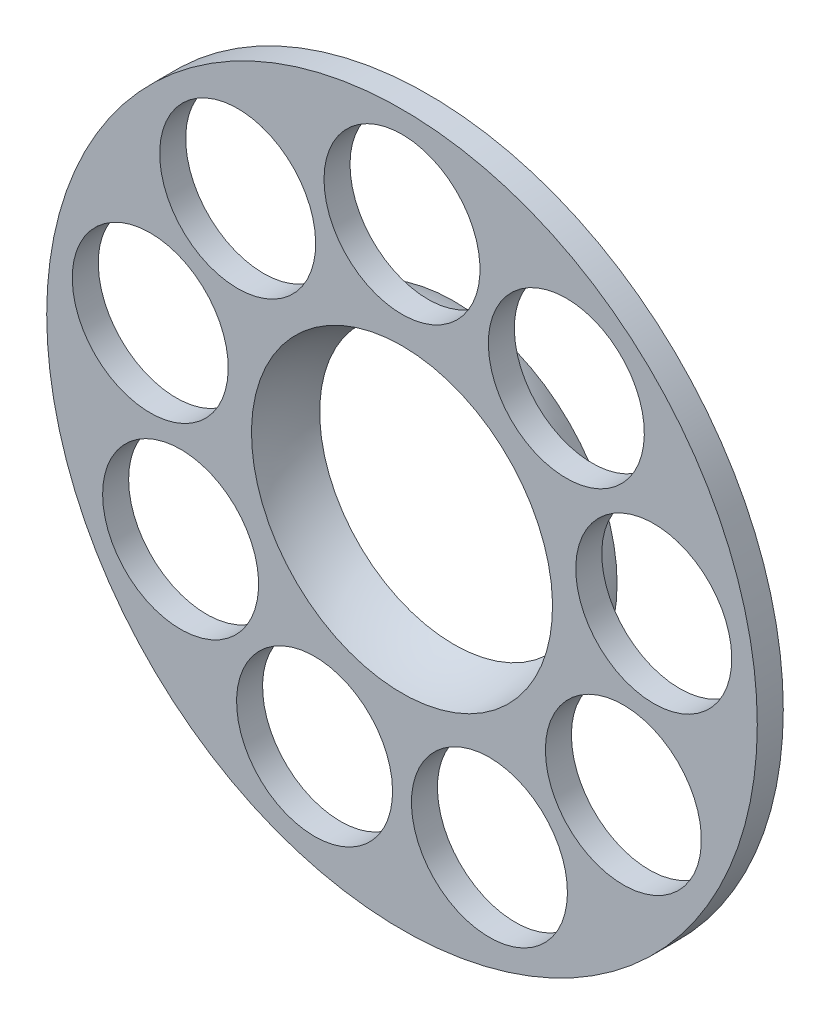
ISO-10303-21;
HEADER;
FILE_DESCRIPTION(('STEP AP214'),'2;1');
FILE_NAME('part.step','',(''),(''),'','','');
FILE_SCHEMA(('AUTOMOTIVE_DESIGN { 1 0 10303 214 1 1 1 1 }'));
ENDSEC;
DATA;
#1=APPLICATION_CONTEXT('core data for automotive mechanical design processes');
#2=APPLICATION_PROTOCOL_DEFINITION('international standard','automotive_design',2000,#1);
#3=PRODUCT_CONTEXT('',#1,'mechanical');
#4=PRODUCT('Part','Part','',(#3));
#5=PRODUCT_RELATED_PRODUCT_CATEGORY('part','',(#4));
#6=PRODUCT_DEFINITION_FORMATION('','',#4);
#7=PRODUCT_DEFINITION_CONTEXT('part definition',#1,'design');
#8=PRODUCT_DEFINITION('design','',#6,#7);
#9=PRODUCT_DEFINITION_SHAPE('','',#8);
#10=(LENGTH_UNIT() NAMED_UNIT(*) SI_UNIT(.MILLI.,.METRE.));
#11=(NAMED_UNIT(*) PLANE_ANGLE_UNIT() SI_UNIT($,.RADIAN.));
#12=(NAMED_UNIT(*) SI_UNIT($,.STERADIAN.) SOLID_ANGLE_UNIT());
#13=UNCERTAINTY_MEASURE_WITH_UNIT(LENGTH_MEASURE(1.E-05),#10,'distance_accuracy_value','');
#14=(GEOMETRIC_REPRESENTATION_CONTEXT(3) GLOBAL_UNCERTAINTY_ASSIGNED_CONTEXT((#13)) GLOBAL_UNIT_ASSIGNED_CONTEXT((#10,
#11,#12)) REPRESENTATION_CONTEXT('',''));
#15=CARTESIAN_POINT('',(0.,0.,0.));
#16=DIRECTION('',(0.,0.,1.));
#17=DIRECTION('',(1.,0.,0.));
#18=AXIS2_PLACEMENT_3D('',#15,#16,#17);
#19=CARTESIAN_POINT('',(0.,0.,2.12403840463596));
#20=DIRECTION('',(0.,0.,1.));
#21=DIRECTION('',(0.,1.,0.));
#22=AXIS2_PLACEMENT_3D('',#19,#20,#21);
#23=SPHERICAL_SURFACE('',#22,20.5);
#24=CARTESIAN_POINT('',(0.,0.,-3.));
#25=DIRECTION('',(0.,0.,1.));
#26=DIRECTION('',(1.,0.,0.));
#27=AXIS2_PLACEMENT_3D('',#24,#25,#26);
#28=CIRCLE('',#27,19.8492879073234);
#29=CARTESIAN_POINT('',(0.,19.8492879073234,-3.));
#30=VERTEX_POINT('',#29);
#31=EDGE_CURVE('E70',#30,#30,#28,.T.);
#32=CARTESIAN_POINT('',(0.,0.,-6.));
#33=DIRECTION('',(0.,0.,1.));
#34=DIRECTION('',(1.,0.,0.));
#35=AXIS2_PLACEMENT_3D('',#32,#33,#34);
#36=CIRCLE('',#35,18.8215302247187);
#37=CARTESIAN_POINT('',(0.,18.8215302247187,-6.));
#38=VERTEX_POINT('',#37);
#39=EDGE_CURVE('E10',#38,#38,#36,.T.);
#40=CARTESIAN_POINT('',(0.,19.8492879073234,-3.));
#41=CARTESIAN_POINT('',(0.,19.8410229613167,-3.03201640847726));
#42=CARTESIAN_POINT('',(0.,19.8326805515252,-3.06401281988834));
#43=CARTESIAN_POINT('',(0.,19.8158410025687,-3.12796490012962));
#44=CARTESIAN_POINT('',(0.,19.8073438634038,-3.15992056895983));
#45=CARTESIAN_POINT('',(0.,19.7901950538967,-3.22379041559085));
#46=CARTESIAN_POINT('',(0.,19.7815433835545,-3.25570459339166));
#47=CARTESIAN_POINT('',(0.,19.7640857144782,-3.31949071074254));
#48=CARTESIAN_POINT('',(0.,19.7552797157441,-3.3513626502926));
#49=CARTESIAN_POINT('',(0.,19.7375135960228,-3.41506354484111));
#50=CARTESIAN_POINT('',(0.,19.7285534750357,-3.44689249983957));
#51=CARTESIAN_POINT('',(0.,19.7104793206256,-3.51050668000886));
#52=CARTESIAN_POINT('',(0.,19.7013652872028,-3.5422919051797));
#53=CARTESIAN_POINT('',(0.,19.6829835213239,-3.60581788143679));
#54=CARTESIAN_POINT('',(0.,19.6737157888678,-3.63755863252304));
#55=CARTESIAN_POINT('',(0.,19.655026841929,-3.70099491739663));
#56=CARTESIAN_POINT('',(0.,19.6456056274463,-3.73269045118398));
#57=CARTESIAN_POINT('',(0.,19.626609937053,-3.79603555930391));
#58=CARTESIAN_POINT('',(0.,19.6170354611424,-3.82768513363648));
#59=CARTESIAN_POINT('',(0.,19.5977334720813,-3.89093758176721));
#60=CARTESIAN_POINT('',(0.,19.5880059589308,-3.92254045556537));
#61=CARTESIAN_POINT('',(0.,19.5683981231612,-3.98569876264111));
#62=CARTESIAN_POINT('',(0.,19.558517800542,-4.01725419591869));
#63=CARTESIAN_POINT('',(0.,19.5386045771841,-4.08031688307794));
#64=CARTESIAN_POINT('',(0.,19.5285716764455,-4.11182413695961));
#65=CARTESIAN_POINT('',(0.,19.5083535317707,-4.17478972757983));
#66=CARTESIAN_POINT('',(0.,19.4981682878346,-4.20624806431839));
#67=CARTESIAN_POINT('',(0.,19.4776456952538,-4.26911508405058));
#68=CARTESIAN_POINT('',(0.,19.4673083466092,-4.30052376704422));
#69=CARTESIAN_POINT('',(0.,19.4464817866621,-4.36329074384744));
#70=CARTESIAN_POINT('',(0.,19.4359925753597,-4.39464903765701));
#71=CARTESIAN_POINT('',(0.,19.4148625357034,-4.45731450183281));
#72=CARTESIAN_POINT('',(0.,19.4042217073496,-4.48862167219904));
#73=CARTESIAN_POINT('',(0.,19.3827886827472,-4.55118415642593));
#74=CARTESIAN_POINT('',(0.,19.3719964864987,-4.58243947028659));
#75=CARTESIAN_POINT('',(0.,19.3502609788079,-4.64489750965436));
#76=CARTESIAN_POINT('',(0.,19.3393176673656,-4.67610023516147));
#77=CARTESIAN_POINT('',(0.,19.3172801855265,-4.73845236720551));
#78=CARTESIAN_POINT('',(0.,19.3061860151297,-4.76960177374243));
#79=CARTESIAN_POINT('',(0.,19.2838470751535,-4.83184653847796));
#80=CARTESIAN_POINT('',(0.,19.272602305574,-4.86294189667656));
#81=CARTESIAN_POINT('',(0.,19.2499624305302,-4.92507783663281));
#82=CARTESIAN_POINT('',(0.,19.238567325066,-4.95611841839048));
#83=CARTESIAN_POINT('',(0.,19.2156270450709,-5.01814407864486));
#84=CARTESIAN_POINT('',(0.,19.2040818705401,-5.04912915714158));
#85=CARTESIAN_POINT('',(0.,19.1808417227439,-5.1110430853537));
#86=CARTESIAN_POINT('',(0.,19.1691467494785,-5.14197193506909));
#87=CARTESIAN_POINT('',(0.,19.1456072780529,-5.20377268151478));
#88=CARTESIAN_POINT('',(0.,19.1337627798926,-5.23464457824508));
#89=CARTESIAN_POINT('',(0.,19.1099245360177,-5.29633069585032));
#90=CARTESIAN_POINT('',(0.,19.0979307903032,-5.32714491672526));
#91=CARTESIAN_POINT('',(0.,19.0737943321555,-5.38871496110019));
#92=CARTESIAN_POINT('',(0.,19.0616516197224,-5.41947078460017));
#93=CARTESIAN_POINT('',(0.,19.03721751246,-5.48092331407239));
#94=CARTESIAN_POINT('',(0.,19.0249261176308,-5.51162002004464));
#95=CARTESIAN_POINT('',(0.,19.0001949333849,-5.57295359569488));
#96=CARTESIAN_POINT('',(0.,18.9877551439682,-5.60359046537289));
#97=CARTESIAN_POINT('',(0.,18.962727461813,-5.66480365106167));
#98=CARTESIAN_POINT('',(0.,18.9501395690745,-5.69537996707244));
#99=CARTESIAN_POINT('',(0.,18.9248159750753,-5.75647132949988));
#100=CARTESIAN_POINT('',(0.,18.9120802738146,-5.78698637591655));
#101=CARTESIAN_POINT('',(0.,18.8864613607844,-5.84795448455814));
#102=CARTESIAN_POINT('',(0.,18.8735781490149,-5.87840754678306));
#103=CARTESIAN_POINT('',(0.,18.8476645173576,-5.93925097428825));
#104=CARTESIAN_POINT('',(0.,18.83463409747,-5.96964133956851));
#105=CARTESIAN_POINT('',(0.,18.8215302247187,-6.));
#106=B_SPLINE_CURVE_WITH_KNOTS('',3,(#40,#41,#42,#43,#44,#45,#46,#47,#48,#49,#50,#51,#52,#53,
#54,#55,#56,#57,#58,#59,#60,#61,#62,#63,#64,#65,#66,#67,#68,#69,#70,#71,#72,#73,#74,#75,#76,#77,
#78,#79,#80,#81,#82,#83,#84,#85,#86,#87,#88,#89,#90,#91,#92,#93,#94,#95,#96,#97,#98,#99,#100,
#101,#102,#103,#104,#105),.UNSPECIFIED.,.F.,.F.,(4,2,2,2,2,2,2,2,2,2,2,2,2,2,2,2,2,2,2,2,2,2,2,
2,2,2,2,2,2,2,2,2,4),(0.,0.0991978754595928,0.198395750919185,0.297593626378775,
0.39679150183837,0.495989377297962,0.595187252757553,0.694385128217146,0.793583003676739,
0.892780879136332,0.991978754595924,1.09117663005552,1.19037450551511,1.2895723809747,
1.38877025643429,1.48796813189388,1.58716600735348,1.68636388281307,1.78556175827266,
1.88475963373225,1.98395750919185,2.08315538465144,2.18235326011103,2.28155113557062,
2.38074901103022,2.47994688648981,2.5791447619494,2.67834263740899,2.77754051286859,
2.87673838832818,2.97593626378777,3.07513413924736,3.17433201470695),.UNSPECIFIED.);
#107=EDGE_CURVE('BSEAM43',#30,#38,#106,.T.);
#108=ORIENTED_EDGE('',*,*,#31,.F.);
#109=ORIENTED_EDGE('',*,*,#39,.T.);
#110=ORIENTED_EDGE('',*,*,#107,.T.);
#111=ORIENTED_EDGE('',*,*,#107,.F.);
#112=EDGE_LOOP('',(#108,#110,#109,#111));
#113=FACE_BOUND('',#112,.T.);
#114=ADVANCED_FACE('F43',(#113),#23,.T.);
#115=CARTESIAN_POINT('',(0.,18.8215302247187,-6.));
#116=DIRECTION('',(0.,0.,1.));
#117=DIRECTION('',(1.,0.,0.));
#118=AXIS2_PLACEMENT_3D('',#115,#116,#117);
#119=PLANE('',#118);
#120=ORIENTED_EDGE('',*,*,#39,.F.);
#121=EDGE_LOOP('',(#120));
#122=FACE_BOUND('',#121,.T.);
#123=CARTESIAN_POINT('',(0.,0.,-6.));
#124=DIRECTION('',(0.,0.,1.));
#125=DIRECTION('',(1.,0.,0.));
#126=AXIS2_PLACEMENT_3D('',#123,#124,#125);
#127=CIRCLE('',#126,15.5);
#128=CARTESIAN_POINT('',(0.,15.5,-6.));
#129=VERTEX_POINT('',#128);
#130=EDGE_CURVE('E50',#129,#129,#127,.T.);
#131=ORIENTED_EDGE('',*,*,#130,.T.);
#132=EDGE_LOOP('',(#131));
#133=FACE_BOUND('',#132,.T.);
#134=ADVANCED_FACE('F178',(#122,#133),#119,.F.);
#135=CARTESIAN_POINT('',(0.,0.,2.12403840463596));
#136=DIRECTION('',(0.,0.,1.));
#137=DIRECTION('',(0.,1.,0.));
#138=AXIS2_PLACEMENT_3D('',#135,#136,#137);
#139=SPHERICAL_SURFACE('',#138,17.5);
#140=CARTESIAN_POINT('',(0.,0.,0.));
#141=DIRECTION('',(0.,0.,1.));
#142=DIRECTION('',(1.,0.,0.));
#143=AXIS2_PLACEMENT_3D('',#140,#141,#142);
#144=CIRCLE('',#143,17.3706206237898);
#145=CARTESIAN_POINT('',(0.,17.3706206237898,0.));
#146=VERTEX_POINT('',#145);
#147=EDGE_CURVE('E55',#146,#146,#144,.T.);
#148=CARTESIAN_POINT('',(0.,15.5,-6.));
#149=CARTESIAN_POINT('',(0.,15.5305575957605,-5.94169864622421));
#150=CARTESIAN_POINT('',(0.,15.5607862216238,-5.88322486933422));
#151=CARTESIAN_POINT('',(0.,15.6205817509866,-5.76593994869087));
#152=CARTESIAN_POINT('',(0.,15.6501486544861,-5.70712880493752));
#153=CARTESIAN_POINT('',(0.,15.7086169565517,-5.58917662993249));
#154=CARTESIAN_POINT('',(0.,15.7375183551178,-5.53003559868081));
#155=CARTESIAN_POINT('',(0.,15.7946519720627,-5.41143118155915));
#156=CARTESIAN_POINT('',(0.,15.8228841904415,-5.35196779568917));
#157=CARTESIAN_POINT('',(0.,15.8786758509155,-5.23272624017228));
#158=CARTESIAN_POINT('',(0.,15.9062352930107,-5.17294807052537));
#159=CARTESIAN_POINT('',(0.,15.9606778921068,-5.05308455920393));
#160=CARTESIAN_POINT('',(0.,15.9875610491078,-4.99299921752939));
#161=CARTESIAN_POINT('',(0.,16.0406476548822,-4.87252901279287));
#162=CARTESIAN_POINT('',(0.,16.0668511036557,-4.81214414973089));
#163=CARTESIAN_POINT('',(0.,16.1185749565056,-4.69108259105716));
#164=CARTESIAN_POINT('',(0.,16.1440953605821,-4.63040589544541));
#165=CARTESIAN_POINT('',(0.,16.1944498745098,-4.50876839765307));
#166=CARTESIAN_POINT('',(0.,16.219283984361,-4.44780759547248));
#167=CARTESIAN_POINT('',(0.,16.2682627477042,-4.32560964670301));
#168=CARTESIAN_POINT('',(0.,16.2924074011963,-4.26437250011413));
#169=CARTESIAN_POINT('',(0.,16.3400041774738,-4.14162965987454));
#170=CARTESIAN_POINT('',(0.,16.3634563002592,-4.08012396622383));
#171=CARTESIAN_POINT('',(0.,16.4096650289569,-3.95685186340152));
#172=CARTESIAN_POINT('',(0.,16.4324216348692,-3.89508545422991));
#173=CARTESIAN_POINT('',(0.,16.4772364322141,-3.77129978510368));
#174=CARTESIAN_POINT('',(0.,16.4992946236467,-3.70928052514904));
#175=CARTESIAN_POINT('',(0.,16.5427097833554,-3.5849970513902));
#176=CARTESIAN_POINT('',(0.,16.5640667516314,-3.52273283758599));
#177=CARTESIAN_POINT('',(0.,16.6060767456368,-3.3979673842515));
#178=CARTESIAN_POINT('',(0.,16.6267297713662,-3.33546614472122));
#179=CARTESIAN_POINT('',(0.,16.6673292505215,-3.21023459823867));
#180=CARTESIAN_POINT('',(0.,16.6872757039474,-3.14750429128639));
#181=CARTESIAN_POINT('',(0.,16.7264594987071,-3.02182259743116));
#182=CARTESIAN_POINT('',(0.,16.7456968400409,-2.9588712105282));
#183=CARTESIAN_POINT('',(0.,16.7834599611192,-2.83275537239309));
#184=CARTESIAN_POINT('',(0.,16.8019857408637,-2.76959092116093));
#185=CARTESIAN_POINT('',(0.,16.8383233798694,-2.64305699711848));
#186=CARTESIAN_POINT('',(0.,16.8561352391307,-2.57968752430818));
#187=CARTESIAN_POINT('',(0.,16.89104276918,-2.45275162596594));
#188=CARTESIAN_POINT('',(0.,16.908138439968,-2.38918520043401));
#189=CARTESIAN_POINT('',(0.,16.9416114162732,-2.26186349058307));
#190=CARTESIAN_POINT('',(0.,16.9579887217904,-2.19810820626407));
#191=CARTESIAN_POINT('',(0.,16.9900228822261,-2.07041689682104));
#192=CARTESIAN_POINT('',(0.,17.0056797371445,-2.006480871697));
#193=CARTESIAN_POINT('',(0.,17.03627100279,-1.87843622163969));
#194=CARTESIAN_POINT('',(0.,17.051205413517,-1.81432759670641));
#195=CARTESIAN_POINT('',(0.,17.0803498891764,-1.68594591000368));
#196=CARTESIAN_POINT('',(0.,17.0945599541089,-1.62167284823424));
#197=CARTESIAN_POINT('',(0.,17.1222539288048,-1.49297047176972));
#198=CARTESIAN_POINT('',(0.,17.1357378385683,-1.42854115707464));
#199=CARTESIAN_POINT('',(0.,17.161977786023,-1.29953447856639));
#200=CARTESIAN_POINT('',(0.,17.1747338237141,-1.23495711475321));
#201=CARTESIAN_POINT('',(0.,17.1995164027659,-1.10566256066276));
#202=CARTESIAN_POINT('',(0.,17.2115429441267,-1.0409453703855));
#203=CARTESIAN_POINT('',(0.,17.2348649992763,-0.911379403842395));
#204=CARTESIAN_POINT('',(0.,17.2461605130651,-0.846530627576547));
#205=CARTESIAN_POINT('',(0.,17.2680190744283,-0.71670974622202));
#206=CARTESIAN_POINT('',(0.,17.2785821220026,-0.65173764113334));
#207=CARTESIAN_POINT('',(0.,17.2989744073625,-0.521678375243601));
#208=CARTESIAN_POINT('',(0.,17.308803645148,-0.456591214442542));
#209=CARTESIAN_POINT('',(0.,17.3277270540622,-0.326310123988419));
#210=CARTESIAN_POINT('',(0.,17.3368212251909,-0.261116194335356));
#211=CARTESIAN_POINT('',(0.,17.3542733626371,-0.130629869991953));
#212=CARTESIAN_POINT('',(0.,17.3626313289547,-0.0653374753016144));
#213=CARTESIAN_POINT('',(0.,17.3706206237898,0.));
#214=B_SPLINE_CURVE_WITH_KNOTS('',3,(#148,#149,#150,#151,#152,#153,#154,#155,#156,#157,#158,
#159,#160,#161,#162,#163,#164,#165,#166,#167,#168,#169,#170,#171,#172,#173,#174,#175,#176,#177,
#178,#179,#180,#181,#182,#183,#184,#185,#186,#187,#188,#189,#190,#191,#192,#193,#194,#195,#196,
#197,#198,#199,#200,#201,#202,#203,#204,#205,#206,#207,#208,#209,#210,#211,#212,#213),
.UNSPECIFIED.,.F.,.F.,(4,2,2,2,2,2,2,2,2,2,2,2,2,2,2,2,2,2,2,2,2,2,2,2,2,2,2,2,2,2,2,2,4),(0.,
0.197471305763762,0.394942611527528,0.59241391729129,0.789885223055054,0.987356528818818,
1.18482783458258,1.38229914034634,1.57977044611011,1.77724175187387,1.97471305763764,
2.1721843634014,2.36965566916516,2.56712697492893,2.76459828069269,2.96206958645646,
3.15954089222022,3.35701219798398,3.55448350374775,3.75195480951151,3.94942611527527,
4.14689742103904,4.3443687268028,4.54184003256657,4.73931133833033,4.93678264409409,
5.13425394985786,5.33172525562162,5.52919656138538,5.72666786714915,5.92413917291291,
6.12161047867668,6.31908178444044),.UNSPECIFIED.);
#215=EDGE_CURVE('BSEAM182',#129,#146,#214,.T.);
#216=ORIENTED_EDGE('',*,*,#130,.F.);
#217=ORIENTED_EDGE('',*,*,#147,.T.);
#218=ORIENTED_EDGE('',*,*,#215,.T.);
#219=ORIENTED_EDGE('',*,*,#215,.F.);
#220=EDGE_LOOP('',(#216,#218,#217,#219));
#221=FACE_BOUND('',#220,.T.);
#222=ADVANCED_FACE('F182',(#221),#139,.F.);
#223=CARTESIAN_POINT('',(0.,17.3706206237898,0.));
#224=DIRECTION('',(0.,0.,-1.));
#225=DIRECTION('',(-1.,0.,0.));
#226=AXIS2_PLACEMENT_3D('',#223,#224,#225);
#227=PLANE('',#226);
#228=CARTESIAN_POINT('',(10.0895942281074,-27.7209323131842,0.));
#229=DIRECTION('',(0.,0.,-1.));
#230=DIRECTION('',(0.939692620785906,0.342020143325676,0.));
#231=AXIS2_PLACEMENT_3D('',#228,#229,#230);
#232=CIRCLE('',#231,9.);
#233=CARTESIAN_POINT('',(18.5468278151806,-24.6427510232531,0.));
#234=VERTEX_POINT('',#233);
#235=EDGE_CURVE('E111',#234,#234,#232,.T.);
#236=ORIENTED_EDGE('',*,*,#235,.T.);
#237=EDGE_LOOP('',(#236));
#238=FACE_BOUND('',#237,.T.);
#239=CARTESIAN_POINT('',(-10.0895942281071,-27.7209323131844,0.));
#240=DIRECTION('',(0.,0.,-1.));
#241=DIRECTION('',(0.939692620785911,-0.342020143325663,0.));
#242=AXIS2_PLACEMENT_3D('',#239,#240,#241);
#243=CIRCLE('',#242,9.);
#244=CARTESIAN_POINT('',(-1.63236064103387,-30.7991136031153,0.));
#245=VERTEX_POINT('',#244);
#246=EDGE_CURVE('E96',#245,#245,#243,.T.);
#247=ORIENTED_EDGE('',*,*,#246,.T.);
#248=EDGE_LOOP('',(#247));
#249=FACE_BOUND('',#248,.T.);
#250=CARTESIAN_POINT('',(-25.5477494116409,-14.7500000000001,0.));
#251=DIRECTION('',(0.,0.,-1.));
#252=DIRECTION('',(0.500000000000004,-0.866025403784436,0.));
#253=AXIS2_PLACEMENT_3D('',#250,#251,#252);
#254=CIRCLE('',#253,9.);
#255=CARTESIAN_POINT('',(-21.0477494116408,-22.54422863406,0.));
#256=VERTEX_POINT('',#255);
#257=EDGE_CURVE('E95',#256,#256,#254,.T.);
#258=ORIENTED_EDGE('',*,*,#257,.T.);
#259=EDGE_LOOP('',(#258));
#260=FACE_BOUND('',#259,.T.);
#261=CARTESIAN_POINT('',(-29.0518287138602,5.12262124117436,0.));
#262=DIRECTION('',(0.,0.,-1.));
#263=DIRECTION('',(-0.173648177666927,-0.984807753012209,0.));
#264=AXIS2_PLACEMENT_3D('',#261,#262,#263);
#265=CIRCLE('',#264,9.);
#266=CARTESIAN_POINT('',(-30.6146623128625,-3.74064853593552,0.));
#267=VERTEX_POINT('',#266);
#268=EDGE_CURVE('E87',#267,#267,#265,.T.);
#269=ORIENTED_EDGE('',*,*,#268,.T.);
#270=EDGE_LOOP('',(#269));
#271=FACE_BOUND('',#270,.T.);
#272=CARTESIAN_POINT('',(18.9622344857526,22.5983110720101,0.));
#273=DIRECTION('',(0.,0.,-1.));
#274=DIRECTION('',(-0.766044443118986,0.64278760968653,0.));
#275=AXIS2_PLACEMENT_3D('',#272,#273,#274);
#276=CIRCLE('',#275,9.);
#277=CARTESIAN_POINT('',(12.0678344976818,28.3833995591889,0.));
#278=VERTEX_POINT('',#277);
#279=EDGE_CURVE('E128',#278,#278,#276,.T.);
#280=ORIENTED_EDGE('',*,*,#279,.T.);
#281=EDGE_LOOP('',(#280));
#282=FACE_BOUND('',#281,.T.);
#283=CARTESIAN_POINT('',(29.0518287138601,5.12262124117474,0.));
#284=DIRECTION('',(0.,0.,-1.));
#285=DIRECTION('',(-0.17364817766694,0.984807753012206,0.));
#286=AXIS2_PLACEMENT_3D('',#283,#284,#285);
#287=CIRCLE('',#286,9.);
#288=CARTESIAN_POINT('',(27.4889951148576,13.9858910182846,0.));
#289=VERTEX_POINT('',#288);
#290=EDGE_CURVE('E127',#289,#289,#287,.T.);
#291=ORIENTED_EDGE('',*,*,#290,.T.);
#292=EDGE_LOOP('',(#291));
#293=FACE_BOUND('',#292,.T.);
#294=CARTESIAN_POINT('',(25.5477494116411,-14.7499999999998,0.));
#295=DIRECTION('',(0.,0.,-1.));
#296=DIRECTION('',(0.499999999999992,0.866025403784443,0.));
#297=AXIS2_PLACEMENT_3D('',#294,#295,#296);
#298=CIRCLE('',#297,9.);
#299=CARTESIAN_POINT('',(30.047749411641,-6.95577136593977,0.));
#300=VERTEX_POINT('',#299);
#301=EDGE_CURVE('E112',#300,#300,#298,.T.);
#302=ORIENTED_EDGE('',*,*,#301,.T.);
#303=EDGE_LOOP('',(#302));
#304=FACE_BOUND('',#303,.T.);
#305=CARTESIAN_POINT('',(-18.9622344857529,22.5983110720098,0.));
#306=DIRECTION('',(0.,0.,-1.));
#307=DIRECTION('',(-0.766044443118977,-0.642787609686541,0.));
#308=AXIS2_PLACEMENT_3D('',#305,#306,#307);
#309=CIRCLE('',#308,9.);
#310=CARTESIAN_POINT('',(-25.8566344738237,16.813222584831,0.));
#311=VERTEX_POINT('',#310);
#312=EDGE_CURVE('E79',#311,#311,#309,.T.);
#313=ORIENTED_EDGE('',*,*,#312,.T.);
#314=EDGE_LOOP('',(#313));
#315=FACE_BOUND('',#314,.T.);
#316=CARTESIAN_POINT('',(0.,29.5,0.));
#317=DIRECTION('',(0.,0.,-1.));
#318=DIRECTION('',(-1.,0.,0.));
#319=AXIS2_PLACEMENT_3D('',#316,#317,#318);
#320=CIRCLE('',#319,9.);
#321=CARTESIAN_POINT('',(-9.,29.5,0.));
#322=VERTEX_POINT('',#321);
#323=EDGE_CURVE('E74',#322,#322,#320,.T.);
#324=ORIENTED_EDGE('',*,*,#323,.T.);
#325=EDGE_LOOP('',(#324));
#326=FACE_BOUND('',#325,.T.);
#327=ORIENTED_EDGE('',*,*,#147,.F.);
#328=EDGE_LOOP('',(#327));
#329=FACE_BOUND('',#328,.T.);
#330=CARTESIAN_POINT('',(0.,0.,0.));
#331=DIRECTION('',(0.,0.,1.));
#332=DIRECTION('',(1.,0.,0.));
#333=AXIS2_PLACEMENT_3D('',#330,#331,#332);
#334=CIRCLE('',#333,41.);
#335=CARTESIAN_POINT('',(41.,0.,0.));
#336=VERTEX_POINT('',#335);
#337=EDGE_CURVE('E60',#336,#336,#334,.T.);
#338=ORIENTED_EDGE('',*,*,#337,.T.);
#339=EDGE_LOOP('',(#338));
#340=FACE_BOUND('',#339,.T.);
#341=ADVANCED_FACE('F147',(#238,#249,#260,#271,#282,#293,#304,#315,#326,#329,#340),#227,.F.);
#342=CARTESIAN_POINT('',(0.,0.,0.));
#343=DIRECTION('',(0.,0.,1.));
#344=DIRECTION('',(1.,0.,0.));
#345=AXIS2_PLACEMENT_3D('',#342,#343,#344);
#346=CYLINDRICAL_SURFACE('',#345,41.);
#347=ORIENTED_EDGE('',*,*,#337,.F.);
#348=EDGE_LOOP('',(#347));
#349=FACE_BOUND('',#348,.T.);
#350=CARTESIAN_POINT('',(0.,0.,-3.));
#351=DIRECTION('',(0.,0.,1.));
#352=DIRECTION('',(1.,0.,0.));
#353=AXIS2_PLACEMENT_3D('',#350,#351,#352);
#354=CIRCLE('',#353,41.);
#355=CARTESIAN_POINT('',(41.,0.,-3.));
#356=VERTEX_POINT('',#355);
#357=EDGE_CURVE('E66',#356,#356,#354,.T.);
#358=ORIENTED_EDGE('',*,*,#357,.T.);
#359=EDGE_LOOP('',(#358));
#360=FACE_BOUND('',#359,.T.);
#361=ADVANCED_FACE('F162',(#349,#360),#346,.T.);
#362=CARTESIAN_POINT('',(0.,41.,-3.));
#363=DIRECTION('',(0.,0.,1.));
#364=DIRECTION('',(1.,0.,0.));
#365=AXIS2_PLACEMENT_3D('',#362,#363,#364);
#366=PLANE('',#365);
#367=CARTESIAN_POINT('',(10.0895942281074,-27.7209323131842,-3.));
#368=DIRECTION('',(0.,0.,-1.));
#369=DIRECTION('',(0.939692620785906,0.342020143325676,0.));
#370=AXIS2_PLACEMENT_3D('',#367,#368,#369);
#371=CIRCLE('',#370,9.);
#372=CARTESIAN_POINT('',(18.5468278151806,-24.6427510232531,-3.));
#373=VERTEX_POINT('',#372);
#374=EDGE_CURVE('E107',#373,#373,#371,.T.);
#375=ORIENTED_EDGE('',*,*,#374,.F.);
#376=EDGE_LOOP('',(#375));
#377=FACE_BOUND('',#376,.T.);
#378=CARTESIAN_POINT('',(-10.0895942281071,-27.7209323131844,-3.));
#379=DIRECTION('',(0.,0.,-1.));
#380=DIRECTION('',(0.939692620785911,-0.342020143325663,0.));
#381=AXIS2_PLACEMENT_3D('',#378,#379,#380);
#382=CIRCLE('',#381,9.);
#383=CARTESIAN_POINT('',(-1.63236064103387,-30.7991136031153,-3.));
#384=VERTEX_POINT('',#383);
#385=EDGE_CURVE('E116',#384,#384,#382,.T.);
#386=ORIENTED_EDGE('',*,*,#385,.F.);
#387=EDGE_LOOP('',(#386));
#388=FACE_BOUND('',#387,.T.);
#389=CARTESIAN_POINT('',(-25.5477494116409,-14.7500000000001,-3.));
#390=DIRECTION('',(0.,0.,-1.));
#391=DIRECTION('',(0.500000000000004,-0.866025403784436,0.));
#392=AXIS2_PLACEMENT_3D('',#389,#390,#391);
#393=CIRCLE('',#392,9.);
#394=CARTESIAN_POINT('',(-21.0477494116408,-22.54422863406,-3.));
#395=VERTEX_POINT('',#394);
#396=EDGE_CURVE('E91',#395,#395,#393,.T.);
#397=ORIENTED_EDGE('',*,*,#396,.F.);
#398=EDGE_LOOP('',(#397));
#399=FACE_BOUND('',#398,.T.);
#400=CARTESIAN_POINT('',(-29.0518287138602,5.12262124117436,-3.));
#401=DIRECTION('',(0.,0.,-1.));
#402=DIRECTION('',(-0.173648177666927,-0.984807753012209,0.));
#403=AXIS2_PLACEMENT_3D('',#400,#401,#402);
#404=CIRCLE('',#403,9.);
#405=CARTESIAN_POINT('',(-30.6146623128625,-3.74064853593552,-3.));
#406=VERTEX_POINT('',#405);
#407=EDGE_CURVE('E100',#406,#406,#404,.T.);
#408=ORIENTED_EDGE('',*,*,#407,.F.);
#409=EDGE_LOOP('',(#408));
#410=FACE_BOUND('',#409,.T.);
#411=CARTESIAN_POINT('',(18.9622344857526,22.5983110720101,-3.));
#412=DIRECTION('',(0.,0.,-1.));
#413=DIRECTION('',(-0.766044443118986,0.64278760968653,0.));
#414=AXIS2_PLACEMENT_3D('',#411,#412,#413);
#415=CIRCLE('',#414,9.);
#416=CARTESIAN_POINT('',(12.0678344976818,28.3833995591889,-3.));
#417=VERTEX_POINT('',#416);
#418=EDGE_CURVE('E139',#417,#417,#415,.T.);
#419=ORIENTED_EDGE('',*,*,#418,.F.);
#420=EDGE_LOOP('',(#419));
#421=FACE_BOUND('',#420,.T.);
#422=CARTESIAN_POINT('',(29.0518287138601,5.12262124117474,-3.));
#423=DIRECTION('',(0.,0.,-1.));
#424=DIRECTION('',(-0.17364817766694,0.984807753012206,0.));
#425=AXIS2_PLACEMENT_3D('',#422,#423,#424);
#426=CIRCLE('',#425,9.);
#427=CARTESIAN_POINT('',(27.4889951148576,13.9858910182846,-3.));
#428=VERTEX_POINT('',#427);
#429=EDGE_CURVE('E123',#428,#428,#426,.T.);
#430=ORIENTED_EDGE('',*,*,#429,.F.);
#431=EDGE_LOOP('',(#430));
#432=FACE_BOUND('',#431,.T.);
#433=CARTESIAN_POINT('',(25.5477494116411,-14.7499999999998,-3.));
#434=DIRECTION('',(0.,0.,-1.));
#435=DIRECTION('',(0.499999999999992,0.866025403784443,0.));
#436=AXIS2_PLACEMENT_3D('',#433,#434,#435);
#437=CIRCLE('',#436,9.);
#438=CARTESIAN_POINT('',(30.047749411641,-6.95577136593977,-3.));
#439=VERTEX_POINT('',#438);
#440=EDGE_CURVE('E132',#439,#439,#437,.T.);
#441=ORIENTED_EDGE('',*,*,#440,.F.);
#442=EDGE_LOOP('',(#441));
#443=FACE_BOUND('',#442,.T.);
#444=CARTESIAN_POINT('',(-18.9622344857529,22.5983110720098,-3.));
#445=DIRECTION('',(0.,0.,-1.));
#446=DIRECTION('',(-0.766044443118977,-0.642787609686541,0.));
#447=AXIS2_PLACEMENT_3D('',#444,#445,#446);
#448=CIRCLE('',#447,9.);
#449=CARTESIAN_POINT('',(-25.8566344738237,16.813222584831,-3.));
#450=VERTEX_POINT('',#449);
#451=EDGE_CURVE('E83',#450,#450,#448,.T.);
#452=ORIENTED_EDGE('',*,*,#451,.F.);
#453=EDGE_LOOP('',(#452));
#454=FACE_BOUND('',#453,.T.);
#455=CARTESIAN_POINT('',(0.,29.5,-3.));
#456=DIRECTION('',(0.,0.,-1.));
#457=DIRECTION('',(-1.,0.,0.));
#458=AXIS2_PLACEMENT_3D('',#455,#456,#457);
#459=CIRCLE('',#458,9.);
#460=CARTESIAN_POINT('',(-9.,29.5,-3.));
#461=VERTEX_POINT('',#460);
#462=EDGE_CURVE('E75',#461,#461,#459,.T.);
#463=ORIENTED_EDGE('',*,*,#462,.F.);
#464=EDGE_LOOP('',(#463));
#465=FACE_BOUND('',#464,.T.);
#466=ORIENTED_EDGE('',*,*,#357,.F.);
#467=EDGE_LOOP('',(#466));
#468=FACE_BOUND('',#467,.T.);
#469=ORIENTED_EDGE('',*,*,#31,.T.);
#470=EDGE_LOOP('',(#469));
#471=FACE_BOUND('',#470,.T.);
#472=ADVANCED_FACE('F158',(#377,#388,#399,#410,#421,#432,#443,#454,#465,#468,#471),#366,.F.);
#473=CARTESIAN_POINT('',(0.,29.5,0.));
#474=DIRECTION('',(0.,0.,-1.));
#475=DIRECTION('',(-1.,0.,0.));
#476=AXIS2_PLACEMENT_3D('',#473,#474,#475);
#477=CYLINDRICAL_SURFACE('',#476,9.);
#478=ORIENTED_EDGE('',*,*,#323,.F.);
#479=EDGE_LOOP('',(#478));
#480=FACE_BOUND('',#479,.T.);
#481=ORIENTED_EDGE('',*,*,#462,.T.);
#482=EDGE_LOOP('',(#481));
#483=FACE_BOUND('',#482,.T.);
#484=ADVANCED_FACE('F161',(#480,#483),#477,.F.);
#485=CARTESIAN_POINT('',(-18.9622344857529,22.5983110720098,0.));
#486=DIRECTION('',(0.,0.,-1.));
#487=DIRECTION('',(-1.,0.,0.));
#488=AXIS2_PLACEMENT_3D('',#485,#486,#487);
#489=CYLINDRICAL_SURFACE('',#488,9.);
#490=ORIENTED_EDGE('',*,*,#312,.F.);
#491=EDGE_LOOP('',(#490));
#492=FACE_BOUND('',#491,.T.);
#493=ORIENTED_EDGE('',*,*,#451,.T.);
#494=EDGE_LOOP('',(#493));
#495=FACE_BOUND('',#494,.T.);
#496=ADVANCED_FACE('F198',(#492,#495),#489,.F.);
#497=CARTESIAN_POINT('',(25.5477494116411,-14.7499999999998,0.));
#498=DIRECTION('',(0.,0.,-1.));
#499=DIRECTION('',(-1.,0.,0.));
#500=AXIS2_PLACEMENT_3D('',#497,#498,#499);
#501=CYLINDRICAL_SURFACE('',#500,9.);
#502=ORIENTED_EDGE('',*,*,#301,.F.);
#503=EDGE_LOOP('',(#502));
#504=FACE_BOUND('',#503,.T.);
#505=ORIENTED_EDGE('',*,*,#440,.T.);
#506=EDGE_LOOP('',(#505));
#507=FACE_BOUND('',#506,.T.);
#508=ADVANCED_FACE('F202',(#504,#507),#501,.F.);
#509=CARTESIAN_POINT('',(29.0518287138601,5.12262124117474,0.));
#510=DIRECTION('',(0.,0.,-1.));
#511=DIRECTION('',(-1.,0.,0.));
#512=AXIS2_PLACEMENT_3D('',#509,#510,#511);
#513=CYLINDRICAL_SURFACE('',#512,9.);
#514=ORIENTED_EDGE('',*,*,#290,.F.);
#515=EDGE_LOOP('',(#514));
#516=FACE_BOUND('',#515,.T.);
#517=ORIENTED_EDGE('',*,*,#429,.T.);
#518=EDGE_LOOP('',(#517));
#519=FACE_BOUND('',#518,.T.);
#520=ADVANCED_FACE('F154',(#516,#519),#513,.F.);
#521=CARTESIAN_POINT('',(18.9622344857526,22.5983110720101,0.));
#522=DIRECTION('',(0.,0.,-1.));
#523=DIRECTION('',(-1.,0.,0.));
#524=AXIS2_PLACEMENT_3D('',#521,#522,#523);
#525=CYLINDRICAL_SURFACE('',#524,9.);
#526=ORIENTED_EDGE('',*,*,#279,.F.);
#527=EDGE_LOOP('',(#526));
#528=FACE_BOUND('',#527,.T.);
#529=ORIENTED_EDGE('',*,*,#418,.T.);
#530=EDGE_LOOP('',(#529));
#531=FACE_BOUND('',#530,.T.);
#532=ADVANCED_FACE('F150',(#528,#531),#525,.F.);
#533=CARTESIAN_POINT('',(-29.0518287138602,5.12262124117436,0.));
#534=DIRECTION('',(0.,0.,-1.));
#535=DIRECTION('',(-1.,0.,0.));
#536=AXIS2_PLACEMENT_3D('',#533,#534,#535);
#537=CYLINDRICAL_SURFACE('',#536,9.);
#538=ORIENTED_EDGE('',*,*,#268,.F.);
#539=EDGE_LOOP('',(#538));
#540=FACE_BOUND('',#539,.T.);
#541=ORIENTED_EDGE('',*,*,#407,.T.);
#542=EDGE_LOOP('',(#541));
#543=FACE_BOUND('',#542,.T.);
#544=ADVANCED_FACE('F153',(#540,#543),#537,.F.);
#545=CARTESIAN_POINT('',(-25.5477494116409,-14.7500000000001,0.));
#546=DIRECTION('',(0.,0.,-1.));
#547=DIRECTION('',(-1.,0.,0.));
#548=AXIS2_PLACEMENT_3D('',#545,#546,#547);
#549=CYLINDRICAL_SURFACE('',#548,9.);
#550=ORIENTED_EDGE('',*,*,#257,.F.);
#551=EDGE_LOOP('',(#550));
#552=FACE_BOUND('',#551,.T.);
#553=ORIENTED_EDGE('',*,*,#396,.T.);
#554=EDGE_LOOP('',(#553));
#555=FACE_BOUND('',#554,.T.);
#556=ADVANCED_FACE('F204',(#552,#555),#549,.F.);
#557=CARTESIAN_POINT('',(-10.0895942281071,-27.7209323131844,0.));
#558=DIRECTION('',(0.,0.,-1.));
#559=DIRECTION('',(-1.,0.,0.));
#560=AXIS2_PLACEMENT_3D('',#557,#558,#559);
#561=CYLINDRICAL_SURFACE('',#560,9.);
#562=ORIENTED_EDGE('',*,*,#246,.F.);
#563=EDGE_LOOP('',(#562));
#564=FACE_BOUND('',#563,.T.);
#565=ORIENTED_EDGE('',*,*,#385,.T.);
#566=EDGE_LOOP('',(#565));
#567=FACE_BOUND('',#566,.T.);
#568=ADVANCED_FACE('F207',(#564,#567),#561,.F.);
#569=CARTESIAN_POINT('',(10.0895942281074,-27.7209323131842,0.));
#570=DIRECTION('',(0.,0.,-1.));
#571=DIRECTION('',(-1.,0.,0.));
#572=AXIS2_PLACEMENT_3D('',#569,#570,#571);
#573=CYLINDRICAL_SURFACE('',#572,9.);
#574=ORIENTED_EDGE('',*,*,#235,.F.);
#575=EDGE_LOOP('',(#574));
#576=FACE_BOUND('',#575,.T.);
#577=ORIENTED_EDGE('',*,*,#374,.T.);
#578=EDGE_LOOP('',(#577));
#579=FACE_BOUND('',#578,.T.);
#580=ADVANCED_FACE('F212',(#576,#579),#573,.F.);
#581=CLOSED_SHELL('',(#114,#134,#222,#341,#361,#472,#484,#496,#508,#520,#532,#544,#556,#568,#580));
#582=MANIFOLD_SOLID_BREP('B2',#581);
#583=ADVANCED_BREP_SHAPE_REPRESENTATION('',(#18,#582),#14);
#584=SHAPE_DEFINITION_REPRESENTATION(#9,#583);
ENDSEC;
END-ISO-10303-21;
